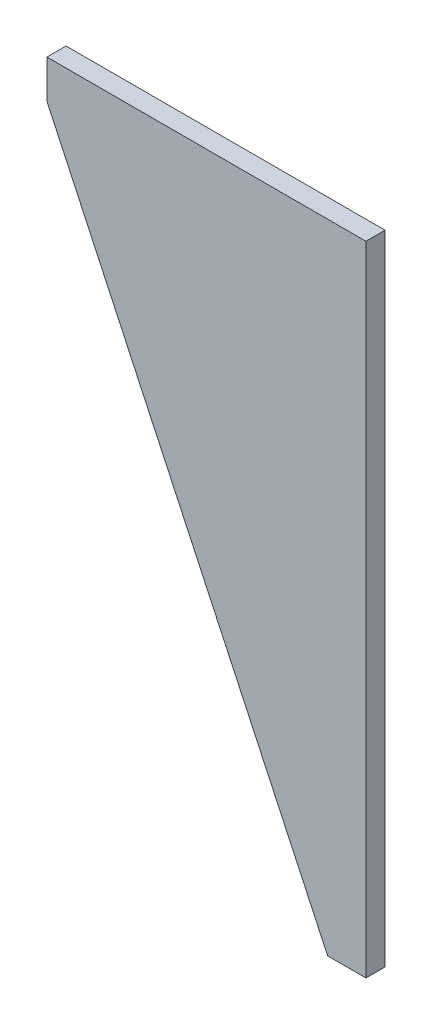
ISO-10303-21;
HEADER;
FILE_DESCRIPTION(('STEP AP214'),'2;1');
FILE_NAME('part.step','',(''),(''),'','','');
FILE_SCHEMA(('AUTOMOTIVE_DESIGN { 1 0 10303 214 1 1 1 1 }'));
ENDSEC;
DATA;
#1=APPLICATION_CONTEXT('core data for automotive mechanical design processes');
#2=APPLICATION_PROTOCOL_DEFINITION('international standard','automotive_design',2000,#1);
#3=PRODUCT_CONTEXT('',#1,'mechanical');
#4=PRODUCT('Part','Part','',(#3));
#5=PRODUCT_RELATED_PRODUCT_CATEGORY('part','',(#4));
#6=PRODUCT_DEFINITION_FORMATION('','',#4);
#7=PRODUCT_DEFINITION_CONTEXT('part definition',#1,'design');
#8=PRODUCT_DEFINITION('design','',#6,#7);
#9=PRODUCT_DEFINITION_SHAPE('','',#8);
#10=(LENGTH_UNIT() NAMED_UNIT(*) SI_UNIT(.MILLI.,.METRE.));
#11=(NAMED_UNIT(*) PLANE_ANGLE_UNIT() SI_UNIT($,.RADIAN.));
#12=(NAMED_UNIT(*) SI_UNIT($,.STERADIAN.) SOLID_ANGLE_UNIT());
#13=UNCERTAINTY_MEASURE_WITH_UNIT(LENGTH_MEASURE(1.E-05),#10,'distance_accuracy_value','');
#14=(GEOMETRIC_REPRESENTATION_CONTEXT(3) GLOBAL_UNCERTAINTY_ASSIGNED_CONTEXT((#13)) GLOBAL_UNIT_ASSIGNED_CONTEXT((#10,
#11,#12)) REPRESENTATION_CONTEXT('',''));
#15=CARTESIAN_POINT('',(0.,0.,0.));
#16=DIRECTION('',(0.,0.,1.));
#17=DIRECTION('',(1.,0.,0.));
#18=AXIS2_PLACEMENT_3D('',#15,#16,#17);
#19=CARTESIAN_POINT('',(0.,6.,3.));
#20=DIRECTION('',(1.,0.,0.));
#21=DIRECTION('',(0.,1.,0.));
#22=AXIS2_PLACEMENT_3D('',#19,#20,#21);
#23=PLANE('',#22);
#24=DIRECTION('',(0.,-1.,0.));
#25=VECTOR('',#24,1.);
#26=CARTESIAN_POINT('',(0.,6.,0.));
#27=LINE('',#26,#25);
#28=CARTESIAN_POINT('',(0.,6.,0.));
#29=VERTEX_POINT('',#28);
#30=CARTESIAN_POINT('',(0.,-94.0000000000001,0.));
#31=VERTEX_POINT('',#30);
#32=EDGE_CURVE('E109',#29,#31,#27,.T.);
#33=ORIENTED_EDGE('',*,*,#32,.F.);
#34=DIRECTION('',(0.,0.,-1.));
#35=VECTOR('',#34,1.);
#36=CARTESIAN_POINT('',(0.,6.,3.));
#37=LINE('',#36,#35);
#38=CARTESIAN_POINT('',(0.,6.,3.));
#39=VERTEX_POINT('',#38);
#40=EDGE_CURVE('E11',#39,#29,#37,.T.);
#41=ORIENTED_EDGE('',*,*,#40,.F.);
#42=DIRECTION('',(0.,-1.,0.));
#43=VECTOR('',#42,1.);
#44=CARTESIAN_POINT('',(0.,6.,3.));
#45=LINE('',#44,#43);
#46=CARTESIAN_POINT('',(0.,-94.0000000000001,3.));
#47=VERTEX_POINT('',#46);
#48=EDGE_CURVE('E104',#39,#47,#45,.T.);
#49=ORIENTED_EDGE('',*,*,#48,.T.);
#50=DIRECTION('',(0.,0.,-1.));
#51=VECTOR('',#50,1.);
#52=CARTESIAN_POINT('',(0.,-94.0000000000001,3.));
#53=LINE('',#52,#51);
#54=EDGE_CURVE('E35',#47,#31,#53,.T.);
#55=ORIENTED_EDGE('',*,*,#54,.T.);
#56=EDGE_LOOP('',(#33,#41,#49,#55));
#57=FACE_BOUND('',#56,.T.);
#58=ADVANCED_FACE('F32',(#57),#23,.T.);
#59=CARTESIAN_POINT('',(-50.,6.,3.));
#60=DIRECTION('',(0.,1.,0.));
#61=DIRECTION('',(-1.,0.,0.));
#62=AXIS2_PLACEMENT_3D('',#59,#60,#61);
#63=PLANE('',#62);
#64=DIRECTION('',(1.,0.,0.));
#65=VECTOR('',#64,1.);
#66=CARTESIAN_POINT('',(-50.,6.,0.));
#67=LINE('',#66,#65);
#68=CARTESIAN_POINT('',(-50.,6.,0.));
#69=VERTEX_POINT('',#68);
#70=EDGE_CURVE('E118',#69,#29,#67,.T.);
#71=ORIENTED_EDGE('',*,*,#70,.F.);
#72=DIRECTION('',(0.,0.,-1.));
#73=VECTOR('',#72,1.);
#74=CARTESIAN_POINT('',(-50.,6.,3.));
#75=LINE('',#74,#73);
#76=CARTESIAN_POINT('',(-50.,6.,3.));
#77=VERTEX_POINT('',#76);
#78=EDGE_CURVE('E41',#77,#69,#75,.T.);
#79=ORIENTED_EDGE('',*,*,#78,.F.);
#80=DIRECTION('',(1.,0.,0.));
#81=VECTOR('',#80,1.);
#82=CARTESIAN_POINT('',(-50.,6.,3.));
#83=LINE('',#82,#81);
#84=EDGE_CURVE('E99',#77,#39,#83,.T.);
#85=ORIENTED_EDGE('',*,*,#84,.T.);
#86=ORIENTED_EDGE('',*,*,#40,.T.);
#87=EDGE_LOOP('',(#71,#79,#85,#86));
#88=FACE_BOUND('',#87,.T.);
#89=ADVANCED_FACE('F124',(#88),#63,.T.);
#90=CARTESIAN_POINT('',(-50.,0.,3.));
#91=DIRECTION('',(-1.,0.,0.));
#92=DIRECTION('',(0.,0.,1.));
#93=AXIS2_PLACEMENT_3D('',#90,#91,#92);
#94=PLANE('',#93);
#95=DIRECTION('',(0.,1.,0.));
#96=VECTOR('',#95,1.);
#97=CARTESIAN_POINT('',(-50.,0.,0.));
#98=LINE('',#97,#96);
#99=CARTESIAN_POINT('',(-50.,0.,0.));
#100=VERTEX_POINT('',#99);
#101=EDGE_CURVE('E88',#100,#69,#98,.T.);
#102=ORIENTED_EDGE('',*,*,#101,.F.);
#103=DIRECTION('',(0.,0.,-1.));
#104=VECTOR('',#103,1.);
#105=CARTESIAN_POINT('',(-50.,0.,3.));
#106=LINE('',#105,#104);
#107=CARTESIAN_POINT('',(-50.,0.,3.));
#108=VERTEX_POINT('',#107);
#109=EDGE_CURVE('E83',#108,#100,#106,.T.);
#110=ORIENTED_EDGE('',*,*,#109,.F.);
#111=DIRECTION('',(0.,1.,0.));
#112=VECTOR('',#111,1.);
#113=CARTESIAN_POINT('',(-50.,0.,3.));
#114=LINE('',#113,#112);
#115=EDGE_CURVE('E86',#108,#77,#114,.T.);
#116=ORIENTED_EDGE('',*,*,#115,.T.);
#117=ORIENTED_EDGE('',*,*,#78,.T.);
#118=EDGE_LOOP('',(#102,#110,#116,#117));
#119=FACE_BOUND('',#118,.T.);
#120=ADVANCED_FACE('F85',(#119),#94,.T.);
#121=CARTESIAN_POINT('',(-6.00000000000001,-94.0000000000001,3.));
#122=DIRECTION('',(-0.905690226558439,-0.42394010604863,0.));
#123=DIRECTION('',(0.423940106048631,-0.905690226558439,0.));
#124=AXIS2_PLACEMENT_3D('',#121,#122,#123);
#125=PLANE('',#124);
#126=DIRECTION('',(-0.423940106048631,0.905690226558439,0.));
#127=VECTOR('',#126,1.);
#128=CARTESIAN_POINT('',(-6.00000000000001,-94.0000000000001,0.));
#129=LINE('',#128,#127);
#130=CARTESIAN_POINT('',(-6.00000000000001,-94.0000000000001,0.));
#131=VERTEX_POINT('',#130);
#132=EDGE_CURVE('E115',#131,#100,#129,.T.);
#133=ORIENTED_EDGE('',*,*,#132,.F.);
#134=DIRECTION('',(0.,0.,-1.));
#135=VECTOR('',#134,1.);
#136=CARTESIAN_POINT('',(-6.00000000000001,-94.0000000000001,3.));
#137=LINE('',#136,#135);
#138=CARTESIAN_POINT('',(-6.00000000000001,-94.0000000000001,3.));
#139=VERTEX_POINT('',#138);
#140=EDGE_CURVE('E93',#139,#131,#137,.T.);
#141=ORIENTED_EDGE('',*,*,#140,.F.);
#142=DIRECTION('',(-0.423940106048631,0.905690226558439,0.));
#143=VECTOR('',#142,1.);
#144=CARTESIAN_POINT('',(-6.00000000000001,-94.0000000000001,3.));
#145=LINE('',#144,#143);
#146=EDGE_CURVE('E98',#139,#108,#145,.T.);
#147=ORIENTED_EDGE('',*,*,#146,.T.);
#148=ORIENTED_EDGE('',*,*,#109,.T.);
#149=EDGE_LOOP('',(#133,#141,#147,#148));
#150=FACE_BOUND('',#149,.T.);
#151=ADVANCED_FACE('F101',(#150),#125,.T.);
#152=CARTESIAN_POINT('',(0.,-94.0000000000001,3.));
#153=DIRECTION('',(0.,-1.,0.));
#154=DIRECTION('',(0.,0.,-1.));
#155=AXIS2_PLACEMENT_3D('',#152,#153,#154);
#156=PLANE('',#155);
#157=DIRECTION('',(-1.,0.,0.));
#158=VECTOR('',#157,1.);
#159=CARTESIAN_POINT('',(0.,-94.0000000000001,0.));
#160=LINE('',#159,#158);
#161=EDGE_CURVE('E112',#31,#131,#160,.T.);
#162=ORIENTED_EDGE('',*,*,#161,.F.);
#163=ORIENTED_EDGE('',*,*,#54,.F.);
#164=DIRECTION('',(-1.,0.,0.));
#165=VECTOR('',#164,1.);
#166=CARTESIAN_POINT('',(0.,-94.0000000000001,3.));
#167=LINE('',#166,#165);
#168=EDGE_CURVE('E102',#47,#139,#167,.T.);
#169=ORIENTED_EDGE('',*,*,#168,.T.);
#170=ORIENTED_EDGE('',*,*,#140,.T.);
#171=EDGE_LOOP('',(#162,#163,#169,#170));
#172=FACE_BOUND('',#171,.T.);
#173=ADVANCED_FACE('F121',(#172),#156,.T.);
#174=CARTESIAN_POINT('',(0.,-94.0000000000001,3.));
#175=DIRECTION('',(0.,0.,-1.));
#176=DIRECTION('',(-1.,0.,0.));
#177=AXIS2_PLACEMENT_3D('',#174,#175,#176);
#178=PLANE('',#177);
#179=ORIENTED_EDGE('',*,*,#48,.F.);
#180=ORIENTED_EDGE('',*,*,#84,.F.);
#181=ORIENTED_EDGE('',*,*,#115,.F.);
#182=ORIENTED_EDGE('',*,*,#146,.F.);
#183=ORIENTED_EDGE('',*,*,#168,.F.);
#184=EDGE_LOOP('',(#179,#180,#181,#182,#183));
#185=FACE_BOUND('',#184,.T.);
#186=ADVANCED_FACE('F97',(#185),#178,.F.);
#187=CARTESIAN_POINT('',(0.,-94.0000000000001,0.));
#188=DIRECTION('',(0.,0.,-1.));
#189=DIRECTION('',(-1.,0.,0.));
#190=AXIS2_PLACEMENT_3D('',#187,#188,#189);
#191=PLANE('',#190);
#192=ORIENTED_EDGE('',*,*,#32,.T.);
#193=ORIENTED_EDGE('',*,*,#161,.T.);
#194=ORIENTED_EDGE('',*,*,#132,.T.);
#195=ORIENTED_EDGE('',*,*,#101,.T.);
#196=ORIENTED_EDGE('',*,*,#70,.T.);
#197=EDGE_LOOP('',(#192,#193,#194,#195,#196));
#198=FACE_BOUND('',#197,.T.);
#199=ADVANCED_FACE('F123',(#198),#191,.T.);
#200=CLOSED_SHELL('',(#58,#89,#120,#151,#173,#186,#199));
#201=MANIFOLD_SOLID_BREP('B2',#200);
#202=ADVANCED_BREP_SHAPE_REPRESENTATION('',(#18,#201),#14);
#203=SHAPE_DEFINITION_REPRESENTATION(#9,#202);
ENDSEC;
END-ISO-10303-21;
